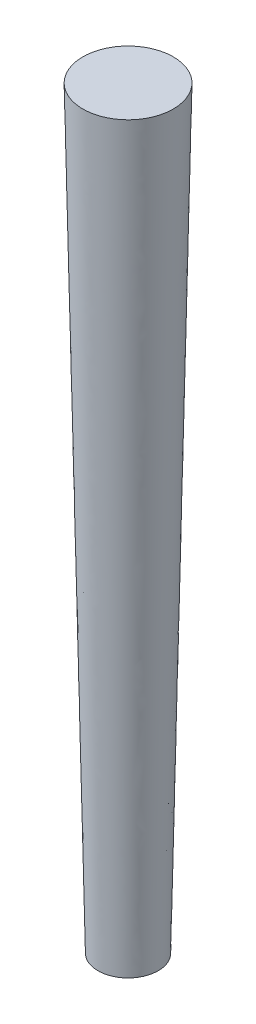
ISO-10303-21;
HEADER;
FILE_DESCRIPTION(('STEP AP214'),'2;1');
FILE_NAME('part.step','',(''),(''),'','','');
FILE_SCHEMA(('AUTOMOTIVE_DESIGN { 1 0 10303 214 1 1 1 1 }'));
ENDSEC;
DATA;
#1=APPLICATION_CONTEXT('core data for automotive mechanical design processes');
#2=APPLICATION_PROTOCOL_DEFINITION('international standard','automotive_design',2000,#1);
#3=PRODUCT_CONTEXT('',#1,'mechanical');
#4=PRODUCT('Part','Part','',(#3));
#5=PRODUCT_RELATED_PRODUCT_CATEGORY('part','',(#4));
#6=PRODUCT_DEFINITION_FORMATION('','',#4);
#7=PRODUCT_DEFINITION_CONTEXT('part definition',#1,'design');
#8=PRODUCT_DEFINITION('design','',#6,#7);
#9=PRODUCT_DEFINITION_SHAPE('','',#8);
#10=(LENGTH_UNIT() NAMED_UNIT(*) SI_UNIT(.MILLI.,.METRE.));
#11=(NAMED_UNIT(*) PLANE_ANGLE_UNIT() SI_UNIT($,.RADIAN.));
#12=(NAMED_UNIT(*) SI_UNIT($,.STERADIAN.) SOLID_ANGLE_UNIT());
#13=UNCERTAINTY_MEASURE_WITH_UNIT(LENGTH_MEASURE(1.E-05),#10,'distance_accuracy_value','');
#14=(GEOMETRIC_REPRESENTATION_CONTEXT(3) GLOBAL_UNCERTAINTY_ASSIGNED_CONTEXT((#13)) GLOBAL_UNIT_ASSIGNED_CONTEXT((#10,
#11,#12)) REPRESENTATION_CONTEXT('',''));
#15=CARTESIAN_POINT('',(0.,0.,0.));
#16=DIRECTION('',(0.,0.,1.));
#17=DIRECTION('',(1.,0.,0.));
#18=AXIS2_PLACEMENT_3D('',#15,#16,#17);
#19=CARTESIAN_POINT('',(0.,-50.,0.));
#20=DIRECTION('',(0.,1.,0.));
#21=DIRECTION('',(0.,0.,1.));
#22=AXIS2_PLACEMENT_3D('',#19,#20,#21);
#23=PLANE('',#22);
#24=CARTESIAN_POINT('',(0.,-50.,0.));
#25=DIRECTION('',(0.,1.,0.));
#26=DIRECTION('',(0.,0.,1.));
#27=AXIS2_PLACEMENT_3D('',#24,#25,#26);
#28=CIRCLE('',#27,2.);
#29=CARTESIAN_POINT('',(1.97040999631571,-50.,0.342760042039799));
#30=VERTEX_POINT('',#29);
#31=EDGE_CURVE('E12',#30,#30,#28,.T.);
#32=ORIENTED_EDGE('',*,*,#31,.F.);
#33=EDGE_LOOP('',(#32));
#34=FACE_BOUND('',#33,.T.);
#35=ADVANCED_FACE('F53',(#34),#23,.F.);
#36=CARTESIAN_POINT('',(0.,0.,0.));
#37=DIRECTION('',(0.,1.,0.));
#38=DIRECTION('',(0.,0.,1.));
#39=AXIS2_PLACEMENT_3D('',#36,#37,#38);
#40=PLANE('',#39);
#41=CARTESIAN_POINT('',(0.,0.,0.));
#42=DIRECTION('',(0.,1.,0.));
#43=DIRECTION('',(0.,0.,1.));
#44=AXIS2_PLACEMENT_3D('',#41,#42,#43);
#45=CIRCLE('',#44,3.);
#46=CARTESIAN_POINT('',(2.96946683621286,0.,0.42692705305708));
#47=VERTEX_POINT('',#46);
#48=EDGE_CURVE('E61',#47,#47,#45,.T.);
#49=ORIENTED_EDGE('',*,*,#48,.T.);
#50=EDGE_LOOP('',(#49));
#51=FACE_BOUND('',#50,.T.);
#52=ADVANCED_FACE('F85',(#51),#40,.T.);
#53=CARTESIAN_POINT('',(2.96946683621286,0.,0.42692705305708));
#54=CARTESIAN_POINT('',(2.63644788958048,-16.6666666666667,0.398871382717986));
#55=CARTESIAN_POINT('',(2.30342894294809,-33.3333333333333,0.370815712378893));
#56=CARTESIAN_POINT('',(1.97040999631571,-50.,0.342760042039799));
#57=CARTESIAN_POINT('',(2.95768546377663,0.,0.508871718975816));
#58=CARTESIAN_POINT('',(2.62544073442293,-16.6666666666667,0.471626140874963));
#59=CARTESIAN_POINT('',(2.29319600506923,-33.3333333333333,0.43438056277411));
#60=CARTESIAN_POINT('',(1.96095127571553,-50.,0.397134984673257));
#61=CARTESIAN_POINT('',(2.92769149053696,0.,0.670262953788943));
#62=CARTESIAN_POINT('',(2.59772673459356,-16.6666666666667,0.614873303607588));
#63=CARTESIAN_POINT('',(2.26776197865017,-33.3333333333333,0.559483653426234));
#64=CARTESIAN_POINT('',(1.93779722270677,-50.,0.504094003244879));
#65=CARTESIAN_POINT('',(2.86428376468368,0.,0.904199053467575));
#66=CARTESIAN_POINT('',(2.53984035911594,-16.6666666666667,0.822379264337222));
#67=CARTESIAN_POINT('',(2.2153969535482,-33.3333333333333,0.740559475206868));
#68=CARTESIAN_POINT('',(1.89095354798046,-50.,0.658739686076515));
#69=CARTESIAN_POINT('',(2.78333619194458,0.,1.12932793913713));
#70=CARTESIAN_POINT('',(2.46642230071405,-16.6666666666667,1.02194271907223));
#71=CARTESIAN_POINT('',(2.14950840948353,-33.3333333333333,0.914557499007333));
#72=CARTESIAN_POINT('',(1.83259451825301,-50.,0.807172278942436));
#73=CARTESIAN_POINT('',(2.19767318884253,0.,2.42331920029184));
#74=CARTESIAN_POINT('',(1.93742600961286,-16.6666666666667,2.16820207576262));
#75=CARTESIAN_POINT('',(1.6771788303832,-33.3333333333333,1.9130849512334));
#76=CARTESIAN_POINT('',(1.41693165115353,-50.,1.65796782670418));
#77=CARTESIAN_POINT('',(0.884187601642708,0.,3.15796879519241));
#78=CARTESIAN_POINT('',(0.765204747793648,-16.6666666666667,2.81256237210115));
#79=CARTESIAN_POINT('',(0.646221893944589,-33.3333333333333,2.46715594900988));
#80=CARTESIAN_POINT('',(0.527239040095529,-50.,2.12174952591862));
#81=CARTESIAN_POINT('',(-2.06582037143182,0.,2.73383938748842));
#82=CARTESIAN_POINT('',(-1.85396654585753,-16.6666666666667,2.41630478642964));
#83=CARTESIAN_POINT('',(-1.64211272028325,-33.3333333333333,2.09877018537086));
#84=CARTESIAN_POINT('',(-1.43025889470896,-50.,1.78123558431207));
#85=CARTESIAN_POINT('',(-3.2050942849373,0.,1.21196626531766));
#86=CARTESIAN_POINT('',(-2.85659099273131,-16.6666666666667,1.05622378042156));
#87=CARTESIAN_POINT('',(-2.50808770052533,-33.3333333333333,0.900481295525459));
#88=CARTESIAN_POINT('',(-2.15958440831935,-50.,0.744738810629362));
#89=CARTESIAN_POINT('',(-2.73383938748842,0.,-2.06582037143182));
#90=CARTESIAN_POINT('',(-2.41630478642964,-16.6666666666667,-1.85396654585753));
#91=CARTESIAN_POINT('',(-2.09877018537085,-33.3333333333333,-1.64211272028324));
#92=CARTESIAN_POINT('',(-1.78123558431207,-50.,-1.43025889470896));
#93=CARTESIAN_POINT('',(-1.21196626531766,0.,-3.2050942849373));
#94=CARTESIAN_POINT('',(-1.05622378042156,-16.6666666666667,-2.85659099273131));
#95=CARTESIAN_POINT('',(-0.90048129552546,-33.3333333333333,-2.50808770052533));
#96=CARTESIAN_POINT('',(-0.744738810629362,-50.,-2.15958440831935));
#97=CARTESIAN_POINT('',(1.73804170775687,0.,-2.78096487723331));
#98=CARTESIAN_POINT('',(1.56294751322962,-16.6666666666667,-2.4603334070598));
#99=CARTESIAN_POINT('',(1.38785331870237,-33.3333333333333,-2.1397019368863));
#100=CARTESIAN_POINT('',(1.21275912417513,-50.,-1.8190704667128));
#101=CARTESIAN_POINT('',(2.7913598330643,0.,-1.70603448787403));
#102=CARTESIAN_POINT('',(2.49209831483752,-16.6666666666667,-1.49805399543867));
#103=CARTESIAN_POINT('',(2.19283679661073,-33.3333333333333,-1.2900735030033));
#104=CARTESIAN_POINT('',(1.89357527838395,-50.,-1.08209301056794));
#105=CARTESIAN_POINT('',(2.98875644546599,0.,-0.299460951026566));
#106=CARTESIAN_POINT('',(2.65834328574803,-16.6666666666667,-0.246610749244086));
#107=CARTESIAN_POINT('',(2.32793012603006,-33.3333333333333,-0.193760547461606));
#108=CARTESIAN_POINT('',(1.9975169663121,-50.,-0.140910345679126));
#109=CARTESIAN_POINT('',(3.00300174483689,0.,-0.0606459679517997));
#110=CARTESIAN_POINT('',(2.66944243552537,-16.6666666666667,-0.0342605840934671));
#111=CARTESIAN_POINT('',(2.33588312621385,-33.3333333333333,-0.00787520023513453));
#112=CARTESIAN_POINT('',(2.00232381690233,-50.,0.0185101836231981));
#113=CARTESIAN_POINT('',(2.99793644671037,0.,0.181678156281889));
#114=CARTESIAN_POINT('',(2.66335551730298,-16.6666666666667,0.181082179032712));
#115=CARTESIAN_POINT('',(2.32877458789558,-33.3333333333333,0.180486201783535));
#116=CARTESIAN_POINT('',(1.99419365848819,-50.,0.179890224534358));
#117=CARTESIAN_POINT('',(2.98124820864908,0.,0.344982387138343));
#118=CARTESIAN_POINT('',(2.64745504473802,-16.6666666666667,0.326116624561009));
#119=CARTESIAN_POINT('',(2.31366188082695,-33.3333333333333,0.307250861983675));
#120=CARTESIAN_POINT('',(1.97986871691589,-50.,0.288385099406341));
#121=CARTESIAN_POINT('',(2.96946683621286,0.,0.42692705305708));
#122=CARTESIAN_POINT('',(2.63644788958048,-16.6666666666667,0.398871382717986));
#123=CARTESIAN_POINT('',(2.30342894294809,-33.3333333333333,0.370815712378893));
#124=CARTESIAN_POINT('',(1.97040999631571,-50.,0.342760042039799));
#125=B_SPLINE_SURFACE_WITH_KNOTS('',3,3,((#53,#54,#55,#56),(#57,#58,#59,#60),(#61,#62,#63,#64),
(#65,#66,#67,#68),(#69,#70,#71,#72),(#73,#74,#75,#76),(#77,#78,#79,#80),(#81,#82,#83,#84),(#85,
#86,#87,#88),(#89,#90,#91,#92),(#93,#94,#95,#96),(#97,#98,#99,#100),(#101,#102,#103,#104),(#105,
#106,#107,#108),(#109,#110,#111,#112),(#113,#114,#115,#116),(#117,#118,#119,#120),(#121,#122,
#123,#124)),.UNSPECIFIED.,.T.,.F.,.F.,(4,1,1,1,1,2,2,2,1,1,1,1,4),(4,4),(0.,0.0125,
0.0249999999999999,0.0375000000000001,0.05,0.25,0.5,0.75,0.95,0.9625,0.975,0.9875,1.),(0.,1.),.UNSPECIFIED.);
#126=CARTESIAN_POINT('',(2.96946683621286,0.,0.42692705305708));
#127=CARTESIAN_POINT('',(2.9590599941306,-0.520833333333333,0.426050313358983));
#128=CARTESIAN_POINT('',(2.94865315204833,-1.04166666666667,0.425173573660886));
#129=CARTESIAN_POINT('',(2.92783946788381,-2.08333333333333,0.423420094264693));
#130=CARTESIAN_POINT('',(2.91743262580155,-2.60416666666667,0.422543354566596));
#131=CARTESIAN_POINT('',(2.89661894163702,-3.64583333333333,0.420789875170403));
#132=CARTESIAN_POINT('',(2.88621209955476,-4.16666666666667,0.419913135472306));
#133=CARTESIAN_POINT('',(2.86539841539024,-5.20833333333333,0.418159656076113));
#134=CARTESIAN_POINT('',(2.85499157330798,-5.72916666666667,0.417282916378016));
#135=CARTESIAN_POINT('',(2.83417788914345,-6.77083333333334,0.415529436981823));
#136=CARTESIAN_POINT('',(2.82377104706119,-7.29166666666667,0.414652697283726));
#137=CARTESIAN_POINT('',(2.80295736289667,-8.33333333333334,0.412899217887533));
#138=CARTESIAN_POINT('',(2.7925505208144,-8.85416666666667,0.412022478189436));
#139=CARTESIAN_POINT('',(2.77173683664988,-9.89583333333333,0.410268998793243));
#140=CARTESIAN_POINT('',(2.76132999456762,-10.4166666666667,0.409392259095146));
#141=CARTESIAN_POINT('',(2.74051631040309,-11.4583333333333,0.407638779698953));
#142=CARTESIAN_POINT('',(2.73010946832083,-11.9791666666667,0.406762040000856));
#143=CARTESIAN_POINT('',(2.70929578415631,-13.0208333333333,0.405008560604663));
#144=CARTESIAN_POINT('',(2.69888894207405,-13.5416666666667,0.404131820906566));
#145=CARTESIAN_POINT('',(2.67807525790952,-14.5833333333333,0.402378341510373));
#146=CARTESIAN_POINT('',(2.66766841582726,-15.1041666666667,0.401501601812276));
#147=CARTESIAN_POINT('',(2.64685473166274,-16.1458333333333,0.399748122416083));
#148=CARTESIAN_POINT('',(2.63644788958048,-16.6666666666667,0.398871382717986));
#149=CARTESIAN_POINT('',(2.61563420541595,-17.7083333333333,0.397117903321793));
#150=CARTESIAN_POINT('',(2.60522736333369,-18.2291666666667,0.396241163623696));
#151=CARTESIAN_POINT('',(2.58441367916916,-19.2708333333333,0.394487684227503));
#152=CARTESIAN_POINT('',(2.5740068370869,-19.7916666666667,0.393610944529406));
#153=CARTESIAN_POINT('',(2.55319315292238,-20.8333333333333,0.391857465133213));
#154=CARTESIAN_POINT('',(2.54278631084012,-21.3541666666667,0.390980725435116));
#155=CARTESIAN_POINT('',(2.52197262667559,-22.3958333333333,0.389227246038923));
#156=CARTESIAN_POINT('',(2.51156578459333,-22.9166666666667,0.388350506340826));
#157=CARTESIAN_POINT('',(2.49075210042881,-23.9583333333333,0.386597026944633));
#158=CARTESIAN_POINT('',(2.48034525834655,-24.4791666666667,0.385720287246536));
#159=CARTESIAN_POINT('',(2.45953157418202,-25.5208333333333,0.383966807850343));
#160=CARTESIAN_POINT('',(2.44912473209976,-26.0416666666667,0.383090068152246));
#161=CARTESIAN_POINT('',(2.42831104793524,-27.0833333333333,0.381336588756053));
#162=CARTESIAN_POINT('',(2.41790420585297,-27.6041666666667,0.380459849057956));
#163=CARTESIAN_POINT('',(2.39709052168845,-28.6458333333333,0.378706369661763));
#164=CARTESIAN_POINT('',(2.38668367960619,-29.1666666666667,0.377829629963666));
#165=CARTESIAN_POINT('',(2.36586999544166,-30.2083333333333,0.376076150567473));
#166=CARTESIAN_POINT('',(2.3554631533594,-30.7291666666667,0.375199410869376));
#167=CARTESIAN_POINT('',(2.33464946919488,-31.7708333333333,0.373445931473183));
#168=CARTESIAN_POINT('',(2.32424262711262,-32.2916666666667,0.372569191775086));
#169=CARTESIAN_POINT('',(2.30342894294809,-33.3333333333333,0.370815712378893));
#170=CARTESIAN_POINT('',(2.29302210086583,-33.8541666666667,0.369938972680796));
#171=CARTESIAN_POINT('',(2.27220841670131,-34.8958333333333,0.368185493284603));
#172=CARTESIAN_POINT('',(2.26180157461904,-35.4166666666667,0.367308753586506));
#173=CARTESIAN_POINT('',(2.24098789045452,-36.4583333333333,0.365555274190313));
#174=CARTESIAN_POINT('',(2.23058104837226,-36.9791666666667,0.364678534492216));
#175=CARTESIAN_POINT('',(2.20976736420774,-38.0208333333333,0.362925055096023));
#176=CARTESIAN_POINT('',(2.19936052212547,-38.5416666666667,0.362048315397926));
#177=CARTESIAN_POINT('',(2.17854683796095,-39.5833333333333,0.360294836001733));
#178=CARTESIAN_POINT('',(2.16813999587869,-40.1041666666667,0.359418096303636));
#179=CARTESIAN_POINT('',(2.14732631171416,-41.1458333333333,0.357664616907443));
#180=CARTESIAN_POINT('',(2.1369194696319,-41.6666666666667,0.356787877209346));
#181=CARTESIAN_POINT('',(2.11610578546738,-42.7083333333333,0.355034397813153));
#182=CARTESIAN_POINT('',(2.10569894338512,-43.2291666666667,0.354157658115056));
#183=CARTESIAN_POINT('',(2.08488525922059,-44.2708333333333,0.352404178718863));
#184=CARTESIAN_POINT('',(2.07447841713833,-44.7916666666667,0.351527439020766));
#185=CARTESIAN_POINT('',(2.05366473297381,-45.8333333333333,0.349773959624573));
#186=CARTESIAN_POINT('',(2.04325789089154,-46.3541666666667,0.348897219926476));
#187=CARTESIAN_POINT('',(2.02244420672702,-47.3958333333333,0.347143740530283));
#188=CARTESIAN_POINT('',(2.01203736464476,-47.9166666666667,0.346267000832186));
#189=CARTESIAN_POINT('',(1.99122368048024,-48.9583333333333,0.344513521435993));
#190=CARTESIAN_POINT('',(1.98081683839797,-49.4791666666667,0.343636781737896));
#191=CARTESIAN_POINT('',(1.97040999631571,-50.,0.342760042039799));
#192=B_SPLINE_CURVE_WITH_KNOTS('',3,(#126,#127,#128,#129,#130,#131,#132,#133,#134,#135,#136,
#137,#138,#139,#140,#141,#142,#143,#144,#145,#146,#147,#148,#149,#150,#151,#152,#153,#154,#155,
#156,#157,#158,#159,#160,#161,#162,#163,#164,#165,#166,#167,#168,#169,#170,#171,#172,#173,#174,
#175,#176,#177,#178,#179,#180,#181,#182,#183,#184,#185,#186,#187,#188,#189,#190,#191),
.UNSPECIFIED.,.F.,.F.,(4,2,2,2,2,2,2,2,2,2,2,2,2,2,2,2,2,2,2,2,2,2,2,2,2,2,2,2,2,2,2,2,4),(0.,
1.5628140930103,3.1256281860206,4.6884422790309,6.25125637204121,7.81407046505151,
9.37688455806181,10.9396986510721,12.5025127440824,14.0653268370927,15.628140930103,
17.1909550231133,18.7537691161236,20.3165832091339,21.8793973021442,23.4422113951545,
25.0050254881648,26.5678395811751,28.1306536741854,29.6934677671957,31.256281860206,
32.8190959532163,34.3819100462266,35.9447241392369,37.5075382322472,39.0703523252575,
40.6331664182678,42.1959805112782,43.7587946042885,45.3216086972988,46.8844227903091,
48.4472368833194,50.0100509763297),.UNSPECIFIED.);
#193=EDGE_CURVE('BSEAM93',#47,#30,#192,.T.);
#194=ORIENTED_EDGE('',*,*,#48,.F.);
#195=ORIENTED_EDGE('',*,*,#31,.T.);
#196=ORIENTED_EDGE('',*,*,#193,.T.);
#197=ORIENTED_EDGE('',*,*,#193,.F.);
#198=EDGE_LOOP('',(#194,#196,#195,#197));
#199=FACE_BOUND('',#198,.T.);
#200=ADVANCED_FACE('F93',(#199),#125,.T.);
#201=CLOSED_SHELL('',(#35,#52,#200));
#202=MANIFOLD_SOLID_BREP('B2',#201);
#203=ADVANCED_BREP_SHAPE_REPRESENTATION('',(#18,#202),#14);
#204=SHAPE_DEFINITION_REPRESENTATION(#9,#203);
ENDSEC;
END-ISO-10303-21;
